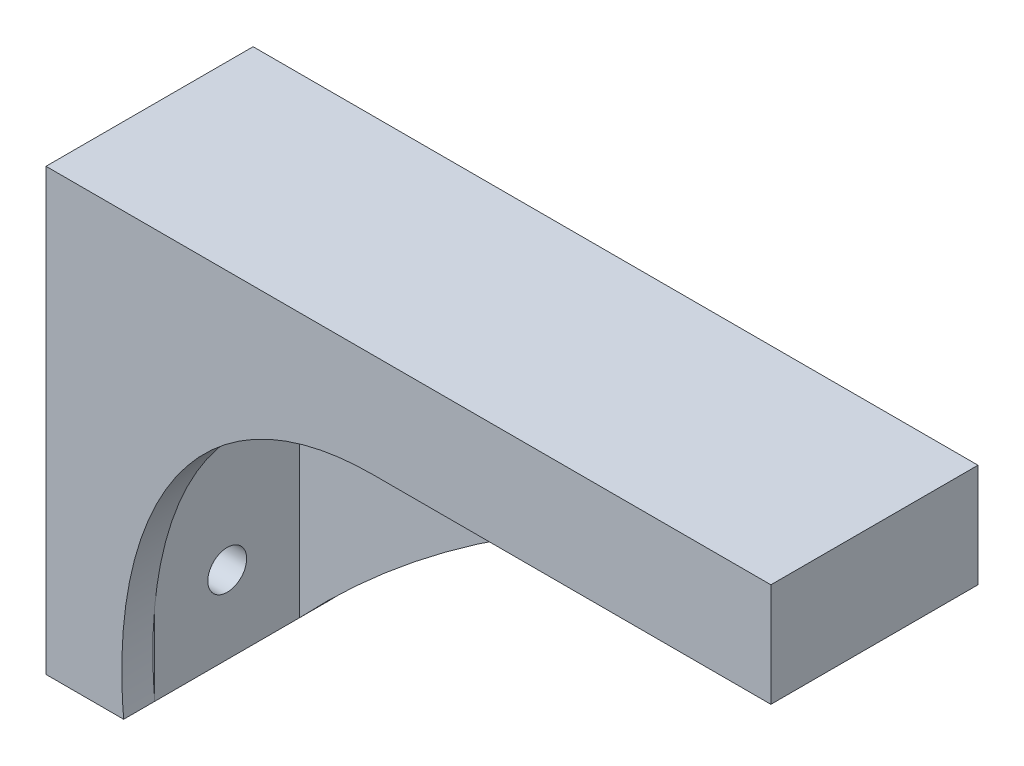
ISO-10303-21;
HEADER;
FILE_DESCRIPTION(('STEP AP214'),'2;1');
FILE_NAME('part.step','',(''),(''),'','','');
FILE_SCHEMA(('AUTOMOTIVE_DESIGN { 1 0 10303 214 1 1 1 1 }'));
ENDSEC;
DATA;
#1=APPLICATION_CONTEXT('core data for automotive mechanical design processes');
#2=APPLICATION_PROTOCOL_DEFINITION('international standard','automotive_design',2000,#1);
#3=PRODUCT_CONTEXT('',#1,'mechanical');
#4=PRODUCT('Part','Part','',(#3));
#5=PRODUCT_RELATED_PRODUCT_CATEGORY('part','',(#4));
#6=PRODUCT_DEFINITION_FORMATION('','',#4);
#7=PRODUCT_DEFINITION_CONTEXT('part definition',#1,'design');
#8=PRODUCT_DEFINITION('design','',#6,#7);
#9=PRODUCT_DEFINITION_SHAPE('','',#8);
#10=(LENGTH_UNIT() NAMED_UNIT(*) SI_UNIT(.MILLI.,.METRE.));
#11=(NAMED_UNIT(*) PLANE_ANGLE_UNIT() SI_UNIT($,.RADIAN.));
#12=(NAMED_UNIT(*) SI_UNIT($,.STERADIAN.) SOLID_ANGLE_UNIT());
#13=UNCERTAINTY_MEASURE_WITH_UNIT(LENGTH_MEASURE(1.E-05),#10,'distance_accuracy_value','');
#14=(GEOMETRIC_REPRESENTATION_CONTEXT(3) GLOBAL_UNCERTAINTY_ASSIGNED_CONTEXT((#13)) GLOBAL_UNIT_ASSIGNED_CONTEXT((#10,
#11,#12)) REPRESENTATION_CONTEXT('',''));
#15=CARTESIAN_POINT('',(0.,0.,0.));
#16=DIRECTION('',(0.,0.,1.));
#17=DIRECTION('',(1.,0.,0.));
#18=AXIS2_PLACEMENT_3D('',#15,#16,#17);
#19=CARTESIAN_POINT('',(177.8,0.,50.8));
#20=DIRECTION('',(0.,-1.,0.));
#21=DIRECTION('',(1.,0.,0.));
#22=AXIS2_PLACEMENT_3D('',#19,#20,#21);
#23=PLANE('',#22);
#24=DIRECTION('',(-1.,0.,0.));
#25=VECTOR('',#24,1.);
#26=CARTESIAN_POINT('',(177.8,0.,0.));
#27=LINE('',#26,#25);
#28=CARTESIAN_POINT('',(177.8,0.,0.));
#29=VERTEX_POINT('',#28);
#30=CARTESIAN_POINT('',(0.,0.,0.));
#31=VERTEX_POINT('',#30);
#32=EDGE_CURVE('E163',#29,#31,#27,.T.);
#33=ORIENTED_EDGE('',*,*,#32,.T.);
#34=DIRECTION('',(0.,0.,-1.));
#35=VECTOR('',#34,1.);
#36=CARTESIAN_POINT('',(0.,0.,50.8));
#37=LINE('',#36,#35);
#38=CARTESIAN_POINT('',(0.,0.,50.8));
#39=VERTEX_POINT('',#38);
#40=EDGE_CURVE('E12',#39,#31,#37,.T.);
#41=ORIENTED_EDGE('',*,*,#40,.F.);
#42=DIRECTION('',(-1.,0.,0.));
#43=VECTOR('',#42,1.);
#44=CARTESIAN_POINT('',(177.8,0.,50.8));
#45=LINE('',#44,#43);
#46=CARTESIAN_POINT('',(177.8,0.,50.8));
#47=VERTEX_POINT('',#46);
#48=EDGE_CURVE('E161',#47,#39,#45,.T.);
#49=ORIENTED_EDGE('',*,*,#48,.F.);
#50=DIRECTION('',(0.,0.,-1.));
#51=VECTOR('',#50,1.);
#52=CARTESIAN_POINT('',(177.8,0.,50.8));
#53=LINE('',#52,#51);
#54=EDGE_CURVE('E167',#47,#29,#53,.T.);
#55=ORIENTED_EDGE('',*,*,#54,.T.);
#56=EDGE_LOOP('',(#33,#41,#49,#55));
#57=FACE_BOUND('',#56,.T.);
#58=ADVANCED_FACE('F45',(#57),#23,.F.);
#59=CARTESIAN_POINT('',(0.,0.,50.8));
#60=DIRECTION('',(1.,0.,0.));
#61=DIRECTION('',(0.,1.,0.));
#62=AXIS2_PLACEMENT_3D('',#59,#60,#61);
#63=PLANE('',#62);
#64=CARTESIAN_POINT('',(0.,-31.75,25.4));
#65=DIRECTION('',(-1.,0.,0.));
#66=DIRECTION('',(0.,0.,1.));
#67=AXIS2_PLACEMENT_3D('',#64,#65,#66);
#68=CIRCLE('',#67,2.24789999999999);
#69=CARTESIAN_POINT('',(0.,-31.75,27.6479));
#70=VERTEX_POINT('',#69);
#71=EDGE_CURVE('E216',#70,#70,#68,.T.);
#72=ORIENTED_EDGE('',*,*,#71,.F.);
#73=EDGE_LOOP('',(#72));
#74=FACE_BOUND('',#73,.T.);
#75=CARTESIAN_POINT('',(0.,-88.9,25.4));
#76=DIRECTION('',(-1.,0.,0.));
#77=DIRECTION('',(0.,0.,1.));
#78=AXIS2_PLACEMENT_3D('',#75,#76,#77);
#79=CIRCLE('',#78,2.24789999999998);
#80=CARTESIAN_POINT('',(0.,-88.9,27.6479));
#81=VERTEX_POINT('',#80);
#82=EDGE_CURVE('E219',#81,#81,#79,.T.);
#83=ORIENTED_EDGE('',*,*,#82,.F.);
#84=EDGE_LOOP('',(#83));
#85=FACE_BOUND('',#84,.T.);
#86=DIRECTION('',(0.,-1.,0.));
#87=VECTOR('',#86,1.);
#88=CARTESIAN_POINT('',(0.,0.,0.));
#89=LINE('',#88,#87);
#90=CARTESIAN_POINT('',(0.,-107.95,0.));
#91=VERTEX_POINT('',#90);
#92=EDGE_CURVE('E156',#31,#91,#89,.T.);
#93=ORIENTED_EDGE('',*,*,#92,.T.);
#94=DIRECTION('',(0.,0.,-1.));
#95=VECTOR('',#94,1.);
#96=CARTESIAN_POINT('',(0.,-107.95,50.8));
#97=LINE('',#96,#95);
#98=CARTESIAN_POINT('',(0.,-107.95,50.8));
#99=VERTEX_POINT('',#98);
#100=EDGE_CURVE('E52',#99,#91,#97,.T.);
#101=ORIENTED_EDGE('',*,*,#100,.F.);
#102=DIRECTION('',(0.,-1.,0.));
#103=VECTOR('',#102,1.);
#104=CARTESIAN_POINT('',(0.,0.,50.8));
#105=LINE('',#104,#103);
#106=EDGE_CURVE('E225',#39,#99,#105,.T.);
#107=ORIENTED_EDGE('',*,*,#106,.F.);
#108=ORIENTED_EDGE('',*,*,#40,.T.);
#109=EDGE_LOOP('',(#93,#101,#107,#108));
#110=FACE_BOUND('',#109,.T.);
#111=ADVANCED_FACE('F263',(#74,#85,#110),#63,.F.);
#112=CARTESIAN_POINT('',(0.,-107.95,50.8));
#113=DIRECTION('',(0.,1.,0.));
#114=DIRECTION('',(0.,0.,1.));
#115=AXIS2_PLACEMENT_3D('',#112,#113,#114);
#116=PLANE('',#115);
#117=DIRECTION('',(1.,0.,0.));
#118=VECTOR('',#117,1.);
#119=CARTESIAN_POINT('',(0.,-107.95,0.));
#120=LINE('',#119,#118);
#121=CARTESIAN_POINT('',(19.05,-107.95,0.));
#122=VERTEX_POINT('',#121);
#123=EDGE_CURVE('E148',#91,#122,#120,.T.);
#124=ORIENTED_EDGE('',*,*,#123,.T.);
#125=DIRECTION('',(0.,0.,-1.));
#126=VECTOR('',#125,1.);
#127=CARTESIAN_POINT('',(19.05,-107.95,7.62));
#128=LINE('',#127,#126);
#129=CARTESIAN_POINT('',(19.05,-107.95,7.62));
#130=VERTEX_POINT('',#129);
#131=EDGE_CURVE('E67',#130,#122,#128,.T.);
#132=ORIENTED_EDGE('',*,*,#131,.F.);
#133=DIRECTION('',(0.,0.,-1.));
#134=VECTOR('',#133,1.);
#135=CARTESIAN_POINT('',(19.05,-107.95,50.8));
#136=LINE('',#135,#134);
#137=CARTESIAN_POINT('',(19.05,-107.95,43.18));
#138=VERTEX_POINT('',#137);
#139=EDGE_CURVE('E128',#138,#130,#136,.T.);
#140=ORIENTED_EDGE('',*,*,#139,.F.);
#141=CARTESIAN_POINT('',(19.05,-107.95,50.8));
#142=VERTEX_POINT('',#141);
#143=EDGE_CURVE('E123',#142,#138,#136,.T.);
#144=ORIENTED_EDGE('',*,*,#143,.F.);
#145=DIRECTION('',(1.,0.,0.));
#146=VECTOR('',#145,1.);
#147=CARTESIAN_POINT('',(0.,-107.95,50.8));
#148=LINE('',#147,#146);
#149=EDGE_CURVE('E149',#99,#142,#148,.T.);
#150=ORIENTED_EDGE('',*,*,#149,.F.);
#151=ORIENTED_EDGE('',*,*,#100,.T.);
#152=EDGE_LOOP('',(#124,#132,#140,#144,#150,#151));
#153=FACE_BOUND('',#152,.T.);
#154=ADVANCED_FACE('F139',(#153),#116,.F.);
#155=CARTESIAN_POINT('',(19.05,-107.95,50.8));
#156=DIRECTION('',(-1.,0.,0.));
#157=DIRECTION('',(0.,0.,1.));
#158=AXIS2_PLACEMENT_3D('',#155,#156,#157);
#159=PLANE('',#158);
#160=CARTESIAN_POINT('',(19.05,-31.75,25.4));
#161=DIRECTION('',(1.,0.,0.));
#162=DIRECTION('',(0.,0.,-1.));
#163=AXIS2_PLACEMENT_3D('',#160,#161,#162);
#164=CIRCLE('',#163,4.76249999999999);
#165=CARTESIAN_POINT('',(19.05,-31.75,20.6375));
#166=VERTEX_POINT('',#165);
#167=EDGE_CURVE('E198',#166,#166,#164,.T.);
#168=ORIENTED_EDGE('',*,*,#167,.F.);
#169=EDGE_LOOP('',(#168));
#170=FACE_BOUND('',#169,.T.);
#171=CARTESIAN_POINT('',(19.05,-88.9,25.4));
#172=DIRECTION('',(1.,0.,0.));
#173=DIRECTION('',(0.,0.,-1.));
#174=AXIS2_PLACEMENT_3D('',#171,#172,#173);
#175=CIRCLE('',#174,4.76249999999999);
#176=CARTESIAN_POINT('',(19.05,-88.9,20.6375));
#177=VERTEX_POINT('',#176);
#178=EDGE_CURVE('E207',#177,#177,#175,.T.);
#179=ORIENTED_EDGE('',*,*,#178,.F.);
#180=EDGE_LOOP('',(#179));
#181=FACE_BOUND('',#180,.T.);
#182=ORIENTED_EDGE('',*,*,#139,.T.);
#183=DIRECTION('',(0.,-1.,0.));
#184=VECTOR('',#183,1.);
#185=CARTESIAN_POINT('',(19.05,-107.95,7.62));
#186=LINE('',#185,#184);
#187=CARTESIAN_POINT('',(19.05,-25.4,7.62));
#188=VERTEX_POINT('',#187);
#189=EDGE_CURVE('E185',#188,#130,#186,.T.);
#190=ORIENTED_EDGE('',*,*,#189,.F.);
#191=DIRECTION('',(0.,0.,-1.));
#192=VECTOR('',#191,1.);
#193=CARTESIAN_POINT('',(19.05,-25.4,50.8));
#194=LINE('',#193,#192);
#195=CARTESIAN_POINT('',(19.05,-25.4,43.18));
#196=VERTEX_POINT('',#195);
#197=EDGE_CURVE('E140',#196,#188,#194,.T.);
#198=ORIENTED_EDGE('',*,*,#197,.F.);
#199=DIRECTION('',(0.,-1.,0.));
#200=VECTOR('',#199,1.);
#201=CARTESIAN_POINT('',(19.05,-107.95,43.18));
#202=LINE('',#201,#200);
#203=CARTESIAN_POINT('',(19.05,-87.7629777696568,43.18));
#204=VERTEX_POINT('',#203);
#205=EDGE_CURVE('E136',#196,#204,#202,.T.);
#206=ORIENTED_EDGE('',*,*,#205,.T.);
#207=EDGE_CURVE('E119',#204,#138,#202,.T.);
#208=ORIENTED_EDGE('',*,*,#207,.T.);
#209=EDGE_LOOP('',(#182,#190,#198,#206,#208));
#210=FACE_BOUND('',#209,.T.);
#211=ADVANCED_FACE('F132',(#170,#181,#210),#159,.F.);
#212=CARTESIAN_POINT('',(19.05,-25.4,50.8));
#213=DIRECTION('',(0.,1.,0.));
#214=DIRECTION('',(-1.,0.,0.));
#215=AXIS2_PLACEMENT_3D('',#212,#213,#214);
#216=PLANE('',#215);
#217=ORIENTED_EDGE('',*,*,#197,.T.);
#218=DIRECTION('',(-1.,0.,0.));
#219=VECTOR('',#218,1.);
#220=CARTESIAN_POINT('',(19.05,-25.4,7.62));
#221=LINE('',#220,#219);
#222=CARTESIAN_POINT('',(177.8,-25.4,7.61999999999999));
#223=VERTEX_POINT('',#222);
#224=EDGE_CURVE('E181',#223,#188,#221,.T.);
#225=ORIENTED_EDGE('',*,*,#224,.F.);
#226=DIRECTION('',(0.,0.,-1.));
#227=VECTOR('',#226,1.);
#228=CARTESIAN_POINT('',(177.8,-25.4,50.8));
#229=LINE('',#228,#227);
#230=CARTESIAN_POINT('',(177.8,-25.4,50.8));
#231=VERTEX_POINT('',#230);
#232=EDGE_CURVE('E142',#231,#223,#229,.T.);
#233=ORIENTED_EDGE('',*,*,#232,.F.);
#234=DIRECTION('',(-1.,0.,0.));
#235=VECTOR('',#234,1.);
#236=CARTESIAN_POINT('',(177.8,-25.4,50.8));
#237=LINE('',#236,#235);
#238=CARTESIAN_POINT('',(80.273648103045,-25.4,50.8));
#239=VERTEX_POINT('',#238);
#240=EDGE_CURVE('E234',#231,#239,#237,.T.);
#241=ORIENTED_EDGE('',*,*,#240,.T.);
#242=DIRECTION('',(0.,0.,1.));
#243=VECTOR('',#242,1.);
#244=CARTESIAN_POINT('',(80.273648103045,-25.4,43.18));
#245=LINE('',#244,#243);
#246=CARTESIAN_POINT('',(80.273648103045,-25.4,43.18));
#247=VERTEX_POINT('',#246);
#248=EDGE_CURVE('E243',#247,#239,#245,.T.);
#249=ORIENTED_EDGE('',*,*,#248,.F.);
#250=DIRECTION('',(-1.,0.,0.));
#251=VECTOR('',#250,1.);
#252=CARTESIAN_POINT('',(19.05,-25.4,43.18));
#253=LINE('',#252,#251);
#254=EDGE_CURVE('E137',#247,#196,#253,.T.);
#255=ORIENTED_EDGE('',*,*,#254,.T.);
#256=EDGE_LOOP('',(#217,#225,#233,#241,#249,#255));
#257=FACE_BOUND('',#256,.T.);
#258=ADVANCED_FACE('F183',(#257),#216,.F.);
#259=CARTESIAN_POINT('',(177.8,-25.4,50.8));
#260=DIRECTION('',(-1.,0.,0.));
#261=DIRECTION('',(0.,0.,1.));
#262=AXIS2_PLACEMENT_3D('',#259,#260,#261);
#263=PLANE('',#262);
#264=DIRECTION('',(0.,1.,0.));
#265=VECTOR('',#264,1.);
#266=CARTESIAN_POINT('',(177.8,-25.4,0.));
#267=LINE('',#266,#265);
#268=CARTESIAN_POINT('',(177.8,-25.4,0.));
#269=VERTEX_POINT('',#268);
#270=EDGE_CURVE('E159',#269,#29,#267,.T.);
#271=ORIENTED_EDGE('',*,*,#270,.T.);
#272=ORIENTED_EDGE('',*,*,#54,.F.);
#273=DIRECTION('',(0.,1.,0.));
#274=VECTOR('',#273,1.);
#275=CARTESIAN_POINT('',(177.8,-25.4,50.8));
#276=LINE('',#275,#274);
#277=EDGE_CURVE('E169',#231,#47,#276,.T.);
#278=ORIENTED_EDGE('',*,*,#277,.F.);
#279=ORIENTED_EDGE('',*,*,#232,.T.);
#280=DIRECTION('',(0.,0.,-1.));
#281=VECTOR('',#280,1.);
#282=CARTESIAN_POINT('',(177.8,-25.4,7.62));
#283=LINE('',#282,#281);
#284=EDGE_CURVE('E175',#223,#269,#283,.T.);
#285=ORIENTED_EDGE('',*,*,#284,.T.);
#286=EDGE_LOOP('',(#271,#272,#278,#279,#285));
#287=FACE_BOUND('',#286,.T.);
#288=ADVANCED_FACE('F173',(#287),#263,.F.);
#289=CARTESIAN_POINT('',(0.,0.,50.8));
#290=DIRECTION('',(0.,0.,1.));
#291=DIRECTION('',(1.,0.,0.));
#292=AXIS2_PLACEMENT_3D('',#289,#290,#291);
#293=PLANE('',#292);
#294=CARTESIAN_POINT('',(80.273648103045,-25.4,50.8));
#295=CARTESIAN_POINT('',(36.871479526852,-25.4,50.8));
#296=CARTESIAN_POINT('',(15.0651366767896,-63.5272615137607,50.8));
#297=CARTESIAN_POINT('',(19.05,-107.95,50.8));
#298=B_SPLINE_CURVE_WITH_KNOTS('',3,(#294,#295,#296,#297),.UNSPECIFIED.,.F.,.F.,(4,4),(0.,1.),.UNSPECIFIED.);
#299=EDGE_CURVE('E120',#239,#142,#298,.T.);
#300=ORIENTED_EDGE('',*,*,#299,.F.);
#301=ORIENTED_EDGE('',*,*,#240,.F.);
#302=ORIENTED_EDGE('',*,*,#277,.T.);
#303=ORIENTED_EDGE('',*,*,#48,.T.);
#304=ORIENTED_EDGE('',*,*,#106,.T.);
#305=ORIENTED_EDGE('',*,*,#149,.T.);
#306=EDGE_LOOP('',(#300,#301,#302,#303,#304,#305));
#307=FACE_BOUND('',#306,.T.);
#308=ADVANCED_FACE('F233',(#307),#293,.T.);
#309=CARTESIAN_POINT('',(0.,0.,0.));
#310=DIRECTION('',(0.,0.,1.));
#311=DIRECTION('',(1.,0.,0.));
#312=AXIS2_PLACEMENT_3D('',#309,#310,#311);
#313=PLANE('',#312);
#314=ORIENTED_EDGE('',*,*,#270,.F.);
#315=CARTESIAN_POINT('',(216.719892516669,-294.165177916671,0.));
#316=DIRECTION('',(0.,0.,-1.));
#317=DIRECTION('',(-1.,0.,0.));
#318=AXIS2_PLACEMENT_3D('',#315,#316,#317);
#319=CIRCLE('',#318,271.568552844561);
#320=EDGE_CURVE('E158',#122,#269,#319,.T.);
#321=ORIENTED_EDGE('',*,*,#320,.F.);
#322=ORIENTED_EDGE('',*,*,#123,.F.);
#323=ORIENTED_EDGE('',*,*,#92,.F.);
#324=ORIENTED_EDGE('',*,*,#32,.F.);
#325=EDGE_LOOP('',(#314,#321,#322,#323,#324));
#326=FACE_BOUND('',#325,.T.);
#327=ADVANCED_FACE('F154',(#326),#313,.F.);
#328=CARTESIAN_POINT('',(0.,-88.9,25.4));
#329=DIRECTION('',(-1.,0.,0.));
#330=DIRECTION('',(0.,0.,1.));
#331=AXIS2_PLACEMENT_3D('',#328,#329,#330);
#332=CYLINDRICAL_SURFACE('',#331,2.24789999999998);
#333=CARTESIAN_POINT('',(6.35000000000002,-88.9,25.4));
#334=DIRECTION('',(1.,0.,0.));
#335=DIRECTION('',(0.,0.,-1.));
#336=AXIS2_PLACEMENT_3D('',#333,#334,#335);
#337=CIRCLE('',#336,2.2479);
#338=CARTESIAN_POINT('',(6.35000000000002,-88.9,23.1521));
#339=VERTEX_POINT('',#338);
#340=EDGE_CURVE('E213',#339,#339,#337,.T.);
#341=ORIENTED_EDGE('',*,*,#340,.T.);
#342=EDGE_LOOP('',(#341));
#343=FACE_BOUND('',#342,.T.);
#344=ORIENTED_EDGE('',*,*,#82,.T.);
#345=EDGE_LOOP('',(#344));
#346=FACE_BOUND('',#345,.T.);
#347=ADVANCED_FACE('F284',(#343,#346),#332,.F.);
#348=CARTESIAN_POINT('',(0.,-31.75,25.4));
#349=DIRECTION('',(-1.,0.,0.));
#350=DIRECTION('',(0.,0.,1.));
#351=AXIS2_PLACEMENT_3D('',#348,#349,#350);
#352=CYLINDRICAL_SURFACE('',#351,2.24789999999998);
#353=CARTESIAN_POINT('',(6.35000000000002,-31.75,25.4));
#354=DIRECTION('',(1.,0.,0.));
#355=DIRECTION('',(0.,0.,-1.));
#356=AXIS2_PLACEMENT_3D('',#353,#354,#355);
#357=CIRCLE('',#356,2.2479);
#358=CARTESIAN_POINT('',(6.35000000000002,-31.75,23.1521));
#359=VERTEX_POINT('',#358);
#360=EDGE_CURVE('E204',#359,#359,#357,.T.);
#361=ORIENTED_EDGE('',*,*,#360,.T.);
#362=EDGE_LOOP('',(#361));
#363=FACE_BOUND('',#362,.T.);
#364=ORIENTED_EDGE('',*,*,#71,.T.);
#365=EDGE_LOOP('',(#364));
#366=FACE_BOUND('',#365,.T.);
#367=ADVANCED_FACE('F289',(#363,#366),#352,.F.);
#368=CARTESIAN_POINT('',(6.35000000000002,-86.6521,25.4));
#369=DIRECTION('',(-1.,0.,0.));
#370=DIRECTION('',(0.,0.,1.));
#371=AXIS2_PLACEMENT_3D('',#368,#369,#370);
#372=PLANE('',#371);
#373=ORIENTED_EDGE('',*,*,#340,.F.);
#374=EDGE_LOOP('',(#373));
#375=FACE_BOUND('',#374,.T.);
#376=CARTESIAN_POINT('',(6.35000000000002,-88.9,25.4));
#377=DIRECTION('',(1.,0.,0.));
#378=DIRECTION('',(0.,0.,-1.));
#379=AXIS2_PLACEMENT_3D('',#376,#377,#378);
#380=CIRCLE('',#379,4.7625);
#381=CARTESIAN_POINT('',(6.35000000000002,-88.9,20.6375));
#382=VERTEX_POINT('',#381);
#383=EDGE_CURVE('E210',#382,#382,#380,.T.);
#384=ORIENTED_EDGE('',*,*,#383,.T.);
#385=EDGE_LOOP('',(#384));
#386=FACE_BOUND('',#385,.T.);
#387=ADVANCED_FACE('F293',(#375,#386),#372,.F.);
#388=CARTESIAN_POINT('',(19.05,-88.9,25.4));
#389=DIRECTION('',(1.,0.,0.));
#390=DIRECTION('',(0.,0.,-1.));
#391=AXIS2_PLACEMENT_3D('',#388,#389,#390);
#392=CYLINDRICAL_SURFACE('',#391,4.7625);
#393=ORIENTED_EDGE('',*,*,#383,.F.);
#394=EDGE_LOOP('',(#393));
#395=FACE_BOUND('',#394,.T.);
#396=ORIENTED_EDGE('',*,*,#178,.T.);
#397=EDGE_LOOP('',(#396));
#398=FACE_BOUND('',#397,.T.);
#399=ADVANCED_FACE('F297',(#395,#398),#392,.F.);
#400=CARTESIAN_POINT('',(6.35000000000002,-29.5021,25.4));
#401=DIRECTION('',(-1.,0.,0.));
#402=DIRECTION('',(0.,0.,1.));
#403=AXIS2_PLACEMENT_3D('',#400,#401,#402);
#404=PLANE('',#403);
#405=ORIENTED_EDGE('',*,*,#360,.F.);
#406=EDGE_LOOP('',(#405));
#407=FACE_BOUND('',#406,.T.);
#408=CARTESIAN_POINT('',(6.35000000000002,-31.75,25.4));
#409=DIRECTION('',(1.,0.,0.));
#410=DIRECTION('',(0.,0.,-1.));
#411=AXIS2_PLACEMENT_3D('',#408,#409,#410);
#412=CIRCLE('',#411,4.7625);
#413=CARTESIAN_POINT('',(6.35000000000002,-31.75,20.6375));
#414=VERTEX_POINT('',#413);
#415=EDGE_CURVE('E201',#414,#414,#412,.T.);
#416=ORIENTED_EDGE('',*,*,#415,.T.);
#417=EDGE_LOOP('',(#416));
#418=FACE_BOUND('',#417,.T.);
#419=ADVANCED_FACE('F259',(#407,#418),#404,.F.);
#420=CARTESIAN_POINT('',(19.05,-31.75,25.4));
#421=DIRECTION('',(1.,0.,0.));
#422=DIRECTION('',(0.,0.,-1.));
#423=AXIS2_PLACEMENT_3D('',#420,#421,#422);
#424=CYLINDRICAL_SURFACE('',#423,4.76249999999999);
#425=ORIENTED_EDGE('',*,*,#415,.F.);
#426=EDGE_LOOP('',(#425));
#427=FACE_BOUND('',#426,.T.);
#428=ORIENTED_EDGE('',*,*,#167,.T.);
#429=EDGE_LOOP('',(#428));
#430=FACE_BOUND('',#429,.T.);
#431=ADVANCED_FACE('F252',(#427,#430),#424,.F.);
#432=CARTESIAN_POINT('',(216.719892516669,-294.165177916671,43.18));
#433=DIRECTION('',(0.,0.,-1.));
#434=DIRECTION('',(-1.,0.,0.));
#435=AXIS2_PLACEMENT_3D('',#432,#433,#434);
#436=PLANE('',#435);
#437=CARTESIAN_POINT('',(80.273648103045,-25.4,43.18));
#438=CARTESIAN_POINT('',(36.871479526852,-25.4,43.18));
#439=CARTESIAN_POINT('',(15.0651366767896,-63.5272615137607,43.18));
#440=CARTESIAN_POINT('',(19.05,-107.95,43.18));
#441=B_SPLINE_CURVE_WITH_KNOTS('',3,(#437,#438,#439,#440),.UNSPECIFIED.,.F.,.F.,(4,4),(0.,1.),.UNSPECIFIED.);
#442=EDGE_CURVE('E59',#247,#204,#441,.T.);
#443=ORIENTED_EDGE('',*,*,#442,.T.);
#444=ORIENTED_EDGE('',*,*,#205,.F.);
#445=ORIENTED_EDGE('',*,*,#254,.F.);
#446=EDGE_LOOP('',(#443,#444,#445));
#447=FACE_BOUND('',#446,.T.);
#448=ADVANCED_FACE('F250',(#447),#436,.T.);
#449=CARTESIAN_POINT('',(216.719892516669,-294.165177916671,7.62));
#450=DIRECTION('',(0.,0.,-1.));
#451=DIRECTION('',(-1.,0.,0.));
#452=AXIS2_PLACEMENT_3D('',#449,#450,#451);
#453=CYLINDRICAL_SURFACE('',#452,271.568552844561);
#454=ORIENTED_EDGE('',*,*,#320,.T.);
#455=ORIENTED_EDGE('',*,*,#284,.F.);
#456=CARTESIAN_POINT('',(216.719892516669,-294.165177916671,7.62));
#457=DIRECTION('',(0.,0.,-1.));
#458=DIRECTION('',(-1.,0.,0.));
#459=AXIS2_PLACEMENT_3D('',#456,#457,#458);
#460=CIRCLE('',#459,271.568552844561);
#461=EDGE_CURVE('E188',#130,#223,#460,.T.);
#462=ORIENTED_EDGE('',*,*,#461,.F.);
#463=ORIENTED_EDGE('',*,*,#131,.T.);
#464=EDGE_LOOP('',(#454,#455,#462,#463));
#465=FACE_BOUND('',#464,.T.);
#466=ADVANCED_FACE('F192',(#465),#453,.F.);
#467=CARTESIAN_POINT('',(216.719892516669,-294.165177916671,7.62));
#468=DIRECTION('',(0.,0.,1.));
#469=DIRECTION('',(-1.,0.,0.));
#470=AXIS2_PLACEMENT_3D('',#467,#468,#469);
#471=PLANE('',#470);
#472=ORIENTED_EDGE('',*,*,#461,.T.);
#473=ORIENTED_EDGE('',*,*,#224,.T.);
#474=ORIENTED_EDGE('',*,*,#189,.T.);
#475=EDGE_LOOP('',(#472,#473,#474));
#476=FACE_BOUND('',#475,.T.);
#477=ADVANCED_FACE('F189',(#476),#471,.T.);
#478=CARTESIAN_POINT('',(31.8916870892462,-50.0164730676603,43.18));
#479=DIRECTION('',(0.,0.,-1.));
#480=DIRECTION('',(-1.,0.,0.));
#481=AXIS2_PLACEMENT_3D('',#478,#479,#480);
#482=PLANE('',#481);
#483=EDGE_CURVE('E115',#204,#138,#441,.T.);
#484=ORIENTED_EDGE('',*,*,#483,.T.);
#485=ORIENTED_EDGE('',*,*,#207,.F.);
#486=EDGE_LOOP('',(#484,#485));
#487=FACE_BOUND('',#486,.T.);
#488=ADVANCED_FACE('F117',(#487),#482,.F.);
#489=DIRECTION('',(0.,0.,1.));
#490=VECTOR('',#489,1.);
#491=SURFACE_OF_LINEAR_EXTRUSION('',#441,#490);
#492=ORIENTED_EDGE('',*,*,#299,.T.);
#493=ORIENTED_EDGE('',*,*,#143,.T.);
#494=ORIENTED_EDGE('',*,*,#483,.F.);
#495=ORIENTED_EDGE('',*,*,#442,.F.);
#496=ORIENTED_EDGE('',*,*,#248,.T.);
#497=EDGE_LOOP('',(#492,#493,#494,#495,#496));
#498=FACE_BOUND('',#497,.T.);
#499=ADVANCED_FACE('F124',(#498),#491,.F.);
#500=CLOSED_SHELL('',(#58,#111,#154,#211,#258,#288,#308,#327,#347,#367,#387,#399,#419,#431,#448,
#466,#477,#488,#499));
#501=MANIFOLD_SOLID_BREP('B2',#500);
#502=ADVANCED_BREP_SHAPE_REPRESENTATION('',(#18,#501),#14);
#503=SHAPE_DEFINITION_REPRESENTATION(#9,#502);
ENDSEC;
END-ISO-10303-21;
